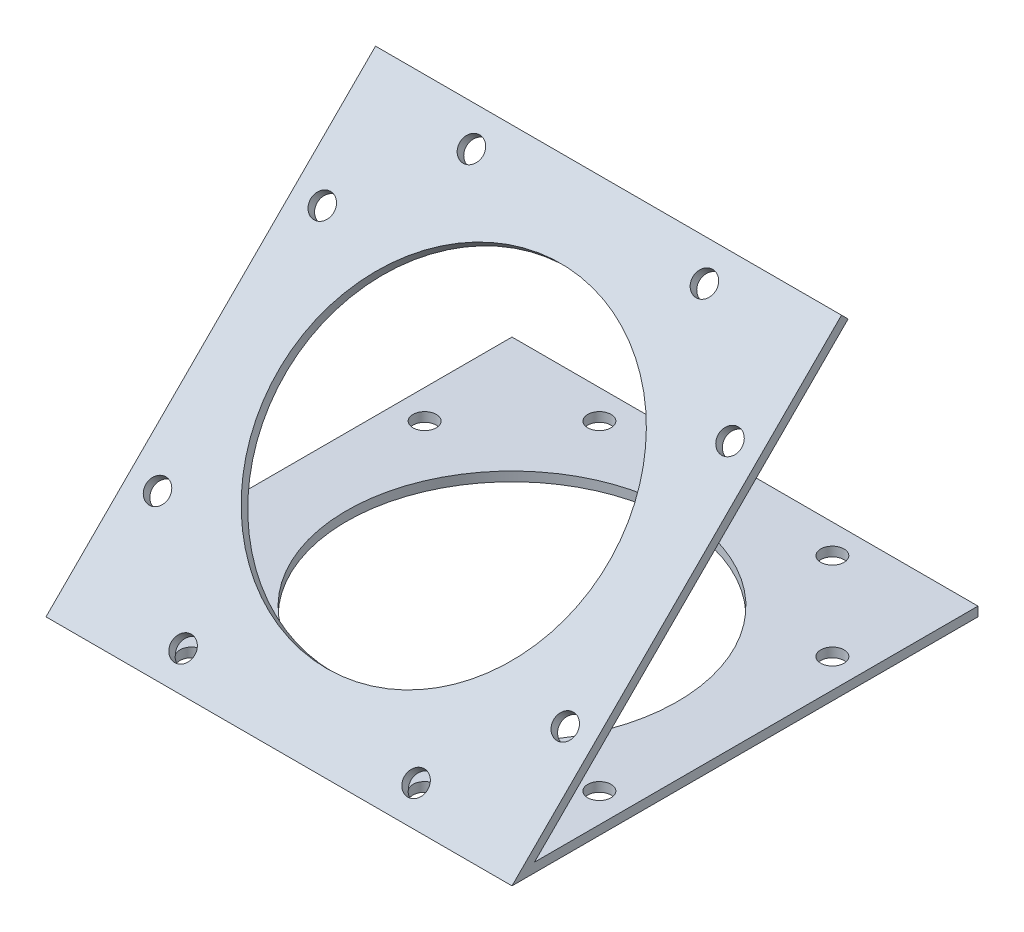
ISO-10303-21;
HEADER;
FILE_DESCRIPTION(('STEP AP214'),'2;1');
FILE_NAME('part.step','',(''),(''),'','','');
FILE_SCHEMA(('AUTOMOTIVE_DESIGN { 1 0 10303 214 1 1 1 1 }'));
ENDSEC;
DATA;
#1=APPLICATION_CONTEXT('core data for automotive mechanical design processes');
#2=APPLICATION_PROTOCOL_DEFINITION('international standard','automotive_design',2000,#1);
#3=PRODUCT_CONTEXT('',#1,'mechanical');
#4=PRODUCT('Part','Part','',(#3));
#5=PRODUCT_RELATED_PRODUCT_CATEGORY('part','',(#4));
#6=PRODUCT_DEFINITION_FORMATION('','',#4);
#7=PRODUCT_DEFINITION_CONTEXT('part definition',#1,'design');
#8=PRODUCT_DEFINITION('design','',#6,#7);
#9=PRODUCT_DEFINITION_SHAPE('','',#8);
#10=(LENGTH_UNIT() NAMED_UNIT(*) SI_UNIT(.MILLI.,.METRE.));
#11=(NAMED_UNIT(*) PLANE_ANGLE_UNIT() SI_UNIT($,.RADIAN.));
#12=(NAMED_UNIT(*) SI_UNIT($,.STERADIAN.) SOLID_ANGLE_UNIT());
#13=UNCERTAINTY_MEASURE_WITH_UNIT(LENGTH_MEASURE(1.E-05),#10,'distance_accuracy_value','');
#14=(GEOMETRIC_REPRESENTATION_CONTEXT(3) GLOBAL_UNCERTAINTY_ASSIGNED_CONTEXT((#13)) GLOBAL_UNIT_ASSIGNED_CONTEXT((#10,
#11,#12)) REPRESENTATION_CONTEXT('',''));
#15=CARTESIAN_POINT('',(0.,0.,0.));
#16=DIRECTION('',(0.,0.,1.));
#17=DIRECTION('',(1.,0.,0.));
#18=AXIS2_PLACEMENT_3D('',#15,#16,#17);
#19=CARTESIAN_POINT('',(200.,141.421356237309,-141.42135623731));
#20=DIRECTION('',(0.,-0.707106781186544,0.707106781186551));
#21=DIRECTION('',(0.,-0.707106781186551,-0.707106781186544));
#22=AXIS2_PLACEMENT_3D('',#19,#20,#21);
#23=PLANE('',#22);
#24=DIRECTION('',(0.,0.707106781186551,0.707106781186544));
#25=VECTOR('',#24,1.);
#26=CARTESIAN_POINT('',(0.,141.421356237309,-141.42135623731));
#27=LINE('',#26,#25);
#28=CARTESIAN_POINT('',(0.,138.592929112563,-144.249783362056));
#29=VERTEX_POINT('',#28);
#30=CARTESIAN_POINT('',(0.,141.421356237309,-141.42135623731));
#31=VERTEX_POINT('',#30);
#32=EDGE_CURVE('E151',#29,#31,#27,.T.);
#33=ORIENTED_EDGE('',*,*,#32,.T.);
#34=DIRECTION('',(-1.,0.,0.));
#35=VECTOR('',#34,1.);
#36=CARTESIAN_POINT('',(200.,141.421356237309,-141.42135623731));
#37=LINE('',#36,#35);
#38=CARTESIAN_POINT('',(200.,141.421356237309,-141.42135623731));
#39=VERTEX_POINT('',#38);
#40=EDGE_CURVE('E246',#39,#31,#37,.T.);
#41=ORIENTED_EDGE('',*,*,#40,.F.);
#42=DIRECTION('',(0.,0.707106781186551,0.707106781186544));
#43=VECTOR('',#42,1.);
#44=CARTESIAN_POINT('',(200.,141.421356237309,-141.42135623731));
#45=LINE('',#44,#43);
#46=CARTESIAN_POINT('',(200.,138.592929112563,-144.249783362056));
#47=VERTEX_POINT('',#46);
#48=EDGE_CURVE('E142',#47,#39,#45,.T.);
#49=ORIENTED_EDGE('',*,*,#48,.F.);
#50=DIRECTION('',(-1.,0.,0.));
#51=VECTOR('',#50,1.);
#52=CARTESIAN_POINT('',(200.,138.592929112563,-144.249783362056));
#53=LINE('',#52,#51);
#54=EDGE_CURVE('E128',#47,#29,#53,.T.);
#55=ORIENTED_EDGE('',*,*,#54,.T.);
#56=EDGE_LOOP('',(#33,#41,#49,#55));
#57=FACE_BOUND('',#56,.T.);
#58=ADVANCED_FACE('F34',(#57),#23,.F.);
#59=CARTESIAN_POINT('',(200.,141.421356237309,-141.42135623731));
#60=DIRECTION('',(0.,-0.707106781186551,-0.707106781186544));
#61=DIRECTION('',(0.,0.707106781186544,-0.707106781186551));
#62=AXIS2_PLACEMENT_3D('',#59,#60,#61);
#63=PLANE('',#62);
#64=CARTESIAN_POINT('',(100.,70.7106781186544,-70.7106781186551));
#65=DIRECTION('',(0.,0.707106781186551,0.707106781186544));
#66=DIRECTION('',(0.,-0.707106781186544,0.707106781186551));
#67=AXIS2_PLACEMENT_3D('',#64,#65,#66);
#68=CIRCLE('',#67,71.);
#69=CARTESIAN_POINT('',(100.,20.5060966544098,-20.50609665441));
#70=VERTEX_POINT('',#69);
#71=EDGE_CURVE('E215',#70,#70,#68,.T.);
#72=ORIENTED_EDGE('',*,*,#71,.F.);
#73=EDGE_LOOP('',(#72));
#74=FACE_BOUND('',#73,.T.);
#75=CARTESIAN_POINT('',(12.5,35.3553390593272,-35.3553390593276));
#76=DIRECTION('',(0.,0.707106781186551,0.707106781186544));
#77=DIRECTION('',(0.,-0.707106781186544,0.707106781186551));
#78=AXIS2_PLACEMENT_3D('',#75,#76,#77);
#79=CIRCLE('',#78,5.);
#80=CARTESIAN_POINT('',(12.5,31.8198051533945,-31.8198051533948));
#81=VERTEX_POINT('',#80);
#82=EDGE_CURVE('E167',#81,#81,#79,.T.);
#83=ORIENTED_EDGE('',*,*,#82,.F.);
#84=EDGE_LOOP('',(#83));
#85=FACE_BOUND('',#84,.T.);
#86=CARTESIAN_POINT('',(50.,132.582521472477,-132.582521472478));
#87=DIRECTION('',(0.,0.707106781186551,0.707106781186544));
#88=DIRECTION('',(0.,-0.707106781186544,0.707106781186551));
#89=AXIS2_PLACEMENT_3D('',#86,#87,#88);
#90=CIRCLE('',#89,5.);
#91=CARTESIAN_POINT('',(50.,129.046987566544,-129.046987566546));
#92=VERTEX_POINT('',#91);
#93=EDGE_CURVE('E175',#92,#92,#90,.T.);
#94=ORIENTED_EDGE('',*,*,#93,.F.);
#95=EDGE_LOOP('',(#94));
#96=FACE_BOUND('',#95,.T.);
#97=CARTESIAN_POINT('',(150.,132.582521472477,-132.582521472478));
#98=DIRECTION('',(0.,0.707106781186551,0.707106781186544));
#99=DIRECTION('',(0.,-0.707106781186544,0.707106781186551));
#100=AXIS2_PLACEMENT_3D('',#97,#98,#99);
#101=CIRCLE('',#100,4.99999999999999);
#102=CARTESIAN_POINT('',(150.,129.046987566544,-129.046987566546));
#103=VERTEX_POINT('',#102);
#104=EDGE_CURVE('E171',#103,#103,#101,.T.);
#105=ORIENTED_EDGE('',*,*,#104,.F.);
#106=EDGE_LOOP('',(#105));
#107=FACE_BOUND('',#106,.T.);
#108=CARTESIAN_POINT('',(187.5,35.3553390593272,-35.3553390593276));
#109=DIRECTION('',(0.,0.707106781186551,0.707106781186544));
#110=DIRECTION('',(0.,0.707106781186544,-0.707106781186551));
#111=AXIS2_PLACEMENT_3D('',#108,#109,#110);
#112=CIRCLE('',#111,5.00000000000002);
#113=CARTESIAN_POINT('',(187.5,38.8908729652599,-38.8908729652603));
#114=VERTEX_POINT('',#113);
#115=EDGE_CURVE('E168',#114,#114,#112,.T.);
#116=ORIENTED_EDGE('',*,*,#115,.F.);
#117=EDGE_LOOP('',(#116));
#118=FACE_BOUND('',#117,.T.);
#119=CARTESIAN_POINT('',(187.5,106.066017177982,-106.066017177983));
#120=DIRECTION('',(0.,0.707106781186551,0.707106781186544));
#121=DIRECTION('',(0.,0.707106781186544,-0.707106781186551));
#122=AXIS2_PLACEMENT_3D('',#119,#120,#121);
#123=CIRCLE('',#122,5.00000000000002);
#124=CARTESIAN_POINT('',(187.5,109.601551083914,-109.601551083915));
#125=VERTEX_POINT('',#124);
#126=EDGE_CURVE('E172',#125,#125,#123,.T.);
#127=ORIENTED_EDGE('',*,*,#126,.F.);
#128=EDGE_LOOP('',(#127));
#129=FACE_BOUND('',#128,.T.);
#130=CARTESIAN_POINT('',(150.,8.83883476483179,-8.83883476483188));
#131=DIRECTION('',(0.,0.707106781186551,0.707106781186544));
#132=DIRECTION('',(0.,0.707106781186544,-0.707106781186551));
#133=AXIS2_PLACEMENT_3D('',#130,#131,#132);
#134=CIRCLE('',#133,4.99999999999999);
#135=CARTESIAN_POINT('',(150.,12.3743686707645,-12.3743686707646));
#136=VERTEX_POINT('',#135);
#137=EDGE_CURVE('E183',#136,#136,#134,.T.);
#138=ORIENTED_EDGE('',*,*,#137,.F.);
#139=EDGE_LOOP('',(#138));
#140=FACE_BOUND('',#139,.T.);
#141=CARTESIAN_POINT('',(50.,8.83883476483181,-8.8388347648319));
#142=DIRECTION('',(0.,0.707106781186551,0.707106781186544));
#143=DIRECTION('',(0.,0.707106781186544,-0.707106781186551));
#144=AXIS2_PLACEMENT_3D('',#141,#142,#143);
#145=CIRCLE('',#144,5.);
#146=CARTESIAN_POINT('',(50.,12.3743686707645,-12.3743686707647));
#147=VERTEX_POINT('',#146);
#148=EDGE_CURVE('E180',#147,#147,#145,.T.);
#149=ORIENTED_EDGE('',*,*,#148,.F.);
#150=EDGE_LOOP('',(#149));
#151=FACE_BOUND('',#150,.T.);
#152=CARTESIAN_POINT('',(12.5,106.066017177982,-106.066017177983));
#153=DIRECTION('',(0.,0.707106781186551,0.707106781186544));
#154=DIRECTION('',(0.,-0.707106781186544,0.707106781186551));
#155=AXIS2_PLACEMENT_3D('',#152,#153,#154);
#156=CIRCLE('',#155,5.);
#157=CARTESIAN_POINT('',(12.5,102.530483272049,-102.53048327205));
#158=VERTEX_POINT('',#157);
#159=EDGE_CURVE('E163',#158,#158,#156,.T.);
#160=ORIENTED_EDGE('',*,*,#159,.F.);
#161=EDGE_LOOP('',(#160));
#162=FACE_BOUND('',#161,.T.);
#163=DIRECTION('',(0.,-0.707106781186544,0.707106781186551));
#164=VECTOR('',#163,1.);
#165=CARTESIAN_POINT('',(0.,141.421356237309,-141.42135623731));
#166=LINE('',#165,#164);
#167=CARTESIAN_POINT('',(0.,0.,0.));
#168=VERTEX_POINT('',#167);
#169=EDGE_CURVE('E149',#31,#168,#166,.T.);
#170=ORIENTED_EDGE('',*,*,#169,.T.);
#171=DIRECTION('',(-1.,0.,0.));
#172=VECTOR('',#171,1.);
#173=CARTESIAN_POINT('',(200.,0.,0.));
#174=LINE('',#173,#172);
#175=CARTESIAN_POINT('',(200.,0.,0.));
#176=VERTEX_POINT('',#175);
#177=EDGE_CURVE('E256',#176,#168,#174,.T.);
#178=ORIENTED_EDGE('',*,*,#177,.F.);
#179=DIRECTION('',(0.,-0.707106781186544,0.707106781186551));
#180=VECTOR('',#179,1.);
#181=CARTESIAN_POINT('',(200.,141.421356237309,-141.42135623731));
#182=LINE('',#181,#180);
#183=EDGE_CURVE('E159',#39,#176,#182,.T.);
#184=ORIENTED_EDGE('',*,*,#183,.F.);
#185=ORIENTED_EDGE('',*,*,#40,.T.);
#186=EDGE_LOOP('',(#170,#178,#184,#185));
#187=FACE_BOUND('',#186,.T.);
#188=ADVANCED_FACE('F238',(#74,#85,#96,#107,#118,#129,#140,#151,#162,#187),#63,.F.);
#189=CARTESIAN_POINT('',(200.,0.,0.));
#190=DIRECTION('',(0.,1.,0.));
#191=DIRECTION('',(0.,0.,1.));
#192=AXIS2_PLACEMENT_3D('',#189,#190,#191);
#193=PLANE('',#192);
#194=CARTESIAN_POINT('',(100.,0.,-100.));
#195=DIRECTION('',(0.,-1.,0.));
#196=DIRECTION('',(0.,0.,-1.));
#197=AXIS2_PLACEMENT_3D('',#194,#195,#196);
#198=CIRCLE('',#197,71.);
#199=CARTESIAN_POINT('',(100.,0.,-171.));
#200=VERTEX_POINT('',#199);
#201=EDGE_CURVE('E218',#200,#200,#198,.T.);
#202=ORIENTED_EDGE('',*,*,#201,.F.);
#203=EDGE_LOOP('',(#202));
#204=FACE_BOUND('',#203,.T.);
#205=CARTESIAN_POINT('',(12.5,0.,-150.));
#206=DIRECTION('',(0.,-1.,0.));
#207=DIRECTION('',(0.,0.,-1.));
#208=AXIS2_PLACEMENT_3D('',#205,#206,#207);
#209=CIRCLE('',#208,5.);
#210=CARTESIAN_POINT('',(12.5,0.,-155.));
#211=VERTEX_POINT('',#210);
#212=EDGE_CURVE('E193',#211,#211,#209,.T.);
#213=ORIENTED_EDGE('',*,*,#212,.F.);
#214=EDGE_LOOP('',(#213));
#215=FACE_BOUND('',#214,.T.);
#216=CARTESIAN_POINT('',(50.,0.,-187.5));
#217=DIRECTION('',(0.,-1.,0.));
#218=DIRECTION('',(0.,0.,-1.));
#219=AXIS2_PLACEMENT_3D('',#216,#217,#218);
#220=CIRCLE('',#219,5.00000000000001);
#221=CARTESIAN_POINT('',(50.,0.,-192.5));
#222=VERTEX_POINT('',#221);
#223=EDGE_CURVE('E201',#222,#222,#220,.T.);
#224=ORIENTED_EDGE('',*,*,#223,.F.);
#225=EDGE_LOOP('',(#224));
#226=FACE_BOUND('',#225,.T.);
#227=CARTESIAN_POINT('',(150.,0.,-187.5));
#228=DIRECTION('',(0.,-1.,0.));
#229=DIRECTION('',(0.,0.,-1.));
#230=AXIS2_PLACEMENT_3D('',#227,#228,#229);
#231=CIRCLE('',#230,4.99999999999999);
#232=CARTESIAN_POINT('',(150.,0.,-192.5));
#233=VERTEX_POINT('',#232);
#234=EDGE_CURVE('E197',#233,#233,#231,.T.);
#235=ORIENTED_EDGE('',*,*,#234,.F.);
#236=EDGE_LOOP('',(#235));
#237=FACE_BOUND('',#236,.T.);
#238=CARTESIAN_POINT('',(150.,0.,-12.5));
#239=DIRECTION('',(0.,-1.,0.));
#240=DIRECTION('',(0.,0.,1.));
#241=AXIS2_PLACEMENT_3D('',#238,#239,#240);
#242=CIRCLE('',#241,4.99999999999999);
#243=CARTESIAN_POINT('',(150.,0.,-7.50000000000002));
#244=VERTEX_POINT('',#243);
#245=EDGE_CURVE('E194',#244,#244,#242,.T.);
#246=ORIENTED_EDGE('',*,*,#245,.F.);
#247=EDGE_LOOP('',(#246));
#248=FACE_BOUND('',#247,.T.);
#249=CARTESIAN_POINT('',(187.5,0.,-50.));
#250=DIRECTION('',(0.,-1.,0.));
#251=DIRECTION('',(0.,0.,1.));
#252=AXIS2_PLACEMENT_3D('',#249,#250,#251);
#253=CIRCLE('',#252,5.00000000000002);
#254=CARTESIAN_POINT('',(187.5,0.,-45.));
#255=VERTEX_POINT('',#254);
#256=EDGE_CURVE('E209',#255,#255,#253,.T.);
#257=ORIENTED_EDGE('',*,*,#256,.F.);
#258=EDGE_LOOP('',(#257));
#259=FACE_BOUND('',#258,.T.);
#260=CARTESIAN_POINT('',(187.5,0.,-150.));
#261=DIRECTION('',(0.,-1.,0.));
#262=DIRECTION('',(0.,0.,1.));
#263=AXIS2_PLACEMENT_3D('',#260,#261,#262);
#264=CIRCLE('',#263,5.00000000000002);
#265=CARTESIAN_POINT('',(187.5,0.,-145.));
#266=VERTEX_POINT('',#265);
#267=EDGE_CURVE('E206',#266,#266,#264,.T.);
#268=ORIENTED_EDGE('',*,*,#267,.F.);
#269=EDGE_LOOP('',(#268));
#270=FACE_BOUND('',#269,.T.);
#271=CARTESIAN_POINT('',(50.,0.,-12.5));
#272=DIRECTION('',(0.,-1.,0.));
#273=DIRECTION('',(0.,0.,1.));
#274=AXIS2_PLACEMENT_3D('',#271,#272,#273);
#275=CIRCLE('',#274,5.00000000000001);
#276=CARTESIAN_POINT('',(50.,0.,-7.49999999999998));
#277=VERTEX_POINT('',#276);
#278=EDGE_CURVE('E198',#277,#277,#275,.T.);
#279=ORIENTED_EDGE('',*,*,#278,.F.);
#280=EDGE_LOOP('',(#279));
#281=FACE_BOUND('',#280,.T.);
#282=CARTESIAN_POINT('',(12.5,0.,-50.));
#283=DIRECTION('',(0.,-1.,0.));
#284=DIRECTION('',(0.,0.,-1.));
#285=AXIS2_PLACEMENT_3D('',#282,#283,#284);
#286=CIRCLE('',#285,5.);
#287=CARTESIAN_POINT('',(12.5,0.,-55.));
#288=VERTEX_POINT('',#287);
#289=EDGE_CURVE('E112',#288,#288,#286,.T.);
#290=ORIENTED_EDGE('',*,*,#289,.F.);
#291=EDGE_LOOP('',(#290));
#292=FACE_BOUND('',#291,.T.);
#293=DIRECTION('',(0.,0.,-1.));
#294=VECTOR('',#293,1.);
#295=CARTESIAN_POINT('',(0.,0.,0.));
#296=LINE('',#295,#294);
#297=CARTESIAN_POINT('',(0.,0.,-200.));
#298=VERTEX_POINT('',#297);
#299=EDGE_CURVE('E147',#168,#298,#296,.T.);
#300=ORIENTED_EDGE('',*,*,#299,.T.);
#301=DIRECTION('',(-1.,0.,0.));
#302=VECTOR('',#301,1.);
#303=CARTESIAN_POINT('',(200.,0.,-200.));
#304=LINE('',#303,#302);
#305=CARTESIAN_POINT('',(200.,0.,-200.));
#306=VERTEX_POINT('',#305);
#307=EDGE_CURVE('E125',#306,#298,#304,.T.);
#308=ORIENTED_EDGE('',*,*,#307,.F.);
#309=DIRECTION('',(0.,0.,-1.));
#310=VECTOR('',#309,1.);
#311=CARTESIAN_POINT('',(200.,0.,0.));
#312=LINE('',#311,#310);
#313=EDGE_CURVE('E157',#176,#306,#312,.T.);
#314=ORIENTED_EDGE('',*,*,#313,.F.);
#315=ORIENTED_EDGE('',*,*,#177,.T.);
#316=EDGE_LOOP('',(#300,#308,#314,#315));
#317=FACE_BOUND('',#316,.T.);
#318=ADVANCED_FACE('F242',(#204,#215,#226,#237,#248,#259,#270,#281,#292,#317),#193,.F.);
#319=CARTESIAN_POINT('',(200.,4.,-200.));
#320=DIRECTION('',(0.,0.,1.));
#321=DIRECTION('',(1.,0.,0.));
#322=AXIS2_PLACEMENT_3D('',#319,#320,#321);
#323=PLANE('',#322);
#324=DIRECTION('',(0.,1.,0.));
#325=VECTOR('',#324,1.);
#326=CARTESIAN_POINT('',(0.,4.,-200.));
#327=LINE('',#326,#325);
#328=CARTESIAN_POINT('',(0.,4.,-200.));
#329=VERTEX_POINT('',#328);
#330=EDGE_CURVE('E145',#298,#329,#327,.T.);
#331=ORIENTED_EDGE('',*,*,#330,.T.);
#332=DIRECTION('',(-1.,0.,0.));
#333=VECTOR('',#332,1.);
#334=CARTESIAN_POINT('',(200.,4.,-200.));
#335=LINE('',#334,#333);
#336=CARTESIAN_POINT('',(200.,4.,-200.));
#337=VERTEX_POINT('',#336);
#338=EDGE_CURVE('E121',#337,#329,#335,.T.);
#339=ORIENTED_EDGE('',*,*,#338,.F.);
#340=DIRECTION('',(0.,1.,0.));
#341=VECTOR('',#340,1.);
#342=CARTESIAN_POINT('',(200.,4.,-200.));
#343=LINE('',#342,#341);
#344=EDGE_CURVE('E155',#306,#337,#343,.T.);
#345=ORIENTED_EDGE('',*,*,#344,.F.);
#346=ORIENTED_EDGE('',*,*,#307,.T.);
#347=EDGE_LOOP('',(#331,#339,#345,#346));
#348=FACE_BOUND('',#347,.T.);
#349=ADVANCED_FACE('F334',(#348),#323,.F.);
#350=CARTESIAN_POINT('',(200.,4.,-9.65685424949253));
#351=DIRECTION('',(0.,-1.,0.));
#352=DIRECTION('',(0.,0.,-1.));
#353=AXIS2_PLACEMENT_3D('',#350,#351,#352);
#354=PLANE('',#353);
#355=CARTESIAN_POINT('',(100.,4.,-100.));
#356=DIRECTION('',(0.,-1.,0.));
#357=DIRECTION('',(0.,0.,-1.));
#358=AXIS2_PLACEMENT_3D('',#355,#356,#357);
#359=CIRCLE('',#358,71.);
#360=CARTESIAN_POINT('',(100.,4.,-171.));
#361=VERTEX_POINT('',#360);
#362=EDGE_CURVE('E37',#361,#361,#359,.T.);
#363=ORIENTED_EDGE('',*,*,#362,.T.);
#364=EDGE_LOOP('',(#363));
#365=FACE_BOUND('',#364,.T.);
#366=CARTESIAN_POINT('',(12.5,4.,-150.));
#367=DIRECTION('',(0.,-1.,0.));
#368=DIRECTION('',(0.,0.,-1.));
#369=AXIS2_PLACEMENT_3D('',#366,#367,#368);
#370=CIRCLE('',#369,5.);
#371=CARTESIAN_POINT('',(12.5,4.,-155.));
#372=VERTEX_POINT('',#371);
#373=EDGE_CURVE('E184',#372,#372,#370,.T.);
#374=ORIENTED_EDGE('',*,*,#373,.T.);
#375=EDGE_LOOP('',(#374));
#376=FACE_BOUND('',#375,.T.);
#377=CARTESIAN_POINT('',(50.,4.,-187.5));
#378=DIRECTION('',(0.,-1.,0.));
#379=DIRECTION('',(0.,0.,-1.));
#380=AXIS2_PLACEMENT_3D('',#377,#378,#379);
#381=CIRCLE('',#380,5.00000000000001);
#382=CARTESIAN_POINT('',(50.,4.,-192.5));
#383=VERTEX_POINT('',#382);
#384=EDGE_CURVE('E289',#383,#383,#381,.T.);
#385=ORIENTED_EDGE('',*,*,#384,.T.);
#386=EDGE_LOOP('',(#385));
#387=FACE_BOUND('',#386,.T.);
#388=CARTESIAN_POINT('',(150.,4.,-187.5));
#389=DIRECTION('',(0.,-1.,0.));
#390=DIRECTION('',(0.,0.,-1.));
#391=AXIS2_PLACEMENT_3D('',#388,#389,#390);
#392=CIRCLE('',#391,4.99999999999999);
#393=CARTESIAN_POINT('',(150.,4.,-192.5));
#394=VERTEX_POINT('',#393);
#395=EDGE_CURVE('E286',#394,#394,#392,.T.);
#396=ORIENTED_EDGE('',*,*,#395,.T.);
#397=EDGE_LOOP('',(#396));
#398=FACE_BOUND('',#397,.T.);
#399=CARTESIAN_POINT('',(187.5,4.,-50.));
#400=DIRECTION('',(0.,-1.,0.));
#401=DIRECTION('',(0.,0.,-1.));
#402=AXIS2_PLACEMENT_3D('',#399,#400,#401);
#403=CIRCLE('',#402,5.00000000000002);
#404=CARTESIAN_POINT('',(187.5,4.,-55.));
#405=VERTEX_POINT('',#404);
#406=EDGE_CURVE('E283',#405,#405,#403,.T.);
#407=ORIENTED_EDGE('',*,*,#406,.T.);
#408=EDGE_LOOP('',(#407));
#409=FACE_BOUND('',#408,.T.);
#410=CARTESIAN_POINT('',(187.5,4.,-150.));
#411=DIRECTION('',(0.,-1.,0.));
#412=DIRECTION('',(0.,0.,-1.));
#413=AXIS2_PLACEMENT_3D('',#410,#411,#412);
#414=CIRCLE('',#413,5.00000000000002);
#415=CARTESIAN_POINT('',(187.5,4.,-155.));
#416=VERTEX_POINT('',#415);
#417=EDGE_CURVE('E280',#416,#416,#414,.T.);
#418=ORIENTED_EDGE('',*,*,#417,.T.);
#419=EDGE_LOOP('',(#418));
#420=FACE_BOUND('',#419,.T.);
#421=CARTESIAN_POINT('',(12.5,4.,-50.));
#422=DIRECTION('',(0.,-1.,0.));
#423=DIRECTION('',(0.,0.,-1.));
#424=AXIS2_PLACEMENT_3D('',#421,#422,#423);
#425=CIRCLE('',#424,5.);
#426=CARTESIAN_POINT('',(12.5,4.,-55.));
#427=VERTEX_POINT('',#426);
#428=EDGE_CURVE('E189',#427,#427,#425,.T.);
#429=ORIENTED_EDGE('',*,*,#428,.T.);
#430=EDGE_LOOP('',(#429));
#431=FACE_BOUND('',#430,.T.);
#432=DIRECTION('',(-1.,0.,0.));
#433=VECTOR('',#432,1.);
#434=CARTESIAN_POINT('',(200.,4.,-9.65685424949253));
#435=LINE('',#434,#433);
#436=CARTESIAN_POINT('',(145.887029997511,4.,-9.65685424949253));
#437=VERTEX_POINT('',#436);
#438=CARTESIAN_POINT('',(54.1129700024888,4.00000000000014,-9.65685424949269));
#439=VERTEX_POINT('',#438);
#440=EDGE_CURVE('E111',#437,#439,#435,.T.);
#441=ORIENTED_EDGE('',*,*,#440,.F.);
#442=CARTESIAN_POINT('',(150.,4.,-12.5));
#443=DIRECTION('',(0.,-1.,0.));
#444=DIRECTION('',(0.,0.,-1.));
#445=AXIS2_PLACEMENT_3D('',#442,#443,#444);
#446=CIRCLE('',#445,4.99999999999999);
#447=CARTESIAN_POINT('',(154.112970002489,4.,-9.65685424949255));
#448=VERTEX_POINT('',#447);
#449=EDGE_CURVE('E55',#437,#448,#446,.T.);
#450=ORIENTED_EDGE('',*,*,#449,.T.);
#451=CARTESIAN_POINT('',(200.,4.,-9.65685424949253));
#452=VERTEX_POINT('',#451);
#453=EDGE_CURVE('E108',#452,#448,#435,.T.);
#454=ORIENTED_EDGE('',*,*,#453,.F.);
#455=DIRECTION('',(0.,0.,1.));
#456=VECTOR('',#455,1.);
#457=CARTESIAN_POINT('',(200.,4.,-9.65685424949253));
#458=LINE('',#457,#456);
#459=EDGE_CURVE('E137',#337,#452,#458,.T.);
#460=ORIENTED_EDGE('',*,*,#459,.F.);
#461=ORIENTED_EDGE('',*,*,#338,.T.);
#462=DIRECTION('',(0.,0.,1.));
#463=VECTOR('',#462,1.);
#464=CARTESIAN_POINT('',(0.,4.,-9.65685424949253));
#465=LINE('',#464,#463);
#466=CARTESIAN_POINT('',(0.,4.,-9.65685424949253));
#467=VERTEX_POINT('',#466);
#468=EDGE_CURVE('E143',#329,#467,#465,.T.);
#469=ORIENTED_EDGE('',*,*,#468,.T.);
#470=CARTESIAN_POINT('',(45.8870299975114,3.99999999999999,-9.65685424949254));
#471=VERTEX_POINT('',#470);
#472=EDGE_CURVE('E123',#471,#467,#435,.T.);
#473=ORIENTED_EDGE('',*,*,#472,.F.);
#474=CARTESIAN_POINT('',(50.,4.,-12.5));
#475=DIRECTION('',(0.,-1.,0.));
#476=DIRECTION('',(0.,0.,-1.));
#477=AXIS2_PLACEMENT_3D('',#474,#475,#476);
#478=CIRCLE('',#477,5.00000000000001);
#479=EDGE_CURVE('E49',#471,#439,#478,.T.);
#480=ORIENTED_EDGE('',*,*,#479,.T.);
#481=EDGE_LOOP('',(#441,#450,#454,#460,#461,#469,#473,#480));
#482=FACE_BOUND('',#481,.T.);
#483=ADVANCED_FACE('F105',(#365,#376,#387,#398,#409,#420,#431,#482),#354,.F.);
#484=CARTESIAN_POINT('',(200.,138.592929112563,-144.249783362056));
#485=DIRECTION('',(0.,0.707106781186551,0.707106781186544));
#486=DIRECTION('',(0.,-0.707106781186544,0.707106781186551));
#487=AXIS2_PLACEMENT_3D('',#484,#485,#486);
#488=PLANE('',#487);
#489=CARTESIAN_POINT('',(100.,67.8822509939082,-73.5391052434013));
#490=DIRECTION('',(0.,0.707106781186551,0.707106781186544));
#491=DIRECTION('',(0.,-0.707106781186544,0.707106781186551));
#492=AXIS2_PLACEMENT_3D('',#489,#490,#491);
#493=CIRCLE('',#492,71.);
#494=CARTESIAN_POINT('',(100.,17.6776695296635,-23.3345237791562));
#495=VERTEX_POINT('',#494);
#496=EDGE_CURVE('E214',#495,#495,#493,.T.);
#497=ORIENTED_EDGE('',*,*,#496,.T.);
#498=EDGE_LOOP('',(#497));
#499=FACE_BOUND('',#498,.T.);
#500=CARTESIAN_POINT('',(12.5,32.5269119345809,-38.1837661840738));
#501=DIRECTION('',(0.,0.707106781186551,0.707106781186544));
#502=DIRECTION('',(0.,-0.707106781186544,0.707106781186551));
#503=AXIS2_PLACEMENT_3D('',#500,#501,#502);
#504=CIRCLE('',#503,5.);
#505=CARTESIAN_POINT('',(12.5,28.9913780286482,-34.648232278141));
#506=VERTEX_POINT('',#505);
#507=EDGE_CURVE('E152',#506,#506,#504,.T.);
#508=ORIENTED_EDGE('',*,*,#507,.T.);
#509=EDGE_LOOP('',(#508));
#510=FACE_BOUND('',#509,.T.);
#511=CARTESIAN_POINT('',(50.,129.754094347731,-135.410948597225));
#512=DIRECTION('',(0.,0.707106781186551,0.707106781186544));
#513=DIRECTION('',(0.,-0.707106781186544,0.707106781186551));
#514=AXIS2_PLACEMENT_3D('',#511,#512,#513);
#515=CIRCLE('',#514,5.);
#516=CARTESIAN_POINT('',(50.,126.218560441798,-131.875414691292));
#517=VERTEX_POINT('',#516);
#518=EDGE_CURVE('E273',#517,#517,#515,.T.);
#519=ORIENTED_EDGE('',*,*,#518,.T.);
#520=EDGE_LOOP('',(#519));
#521=FACE_BOUND('',#520,.T.);
#522=CARTESIAN_POINT('',(150.,129.754094347731,-135.410948597225));
#523=DIRECTION('',(0.,0.707106781186551,0.707106781186544));
#524=DIRECTION('',(0.,-0.707106781186544,0.707106781186551));
#525=AXIS2_PLACEMENT_3D('',#522,#523,#524);
#526=CIRCLE('',#525,4.99999999999999);
#527=CARTESIAN_POINT('',(150.,126.218560441798,-131.875414691292));
#528=VERTEX_POINT('',#527);
#529=EDGE_CURVE('E270',#528,#528,#526,.T.);
#530=ORIENTED_EDGE('',*,*,#529,.T.);
#531=EDGE_LOOP('',(#530));
#532=FACE_BOUND('',#531,.T.);
#533=CARTESIAN_POINT('',(187.5,32.5269119345809,-38.1837661840738));
#534=DIRECTION('',(0.,0.707106781186551,0.707106781186544));
#535=DIRECTION('',(0.,-0.707106781186544,0.707106781186551));
#536=AXIS2_PLACEMENT_3D('',#533,#534,#535);
#537=CIRCLE('',#536,5.00000000000002);
#538=CARTESIAN_POINT('',(187.5,28.9913780286482,-34.648232278141));
#539=VERTEX_POINT('',#538);
#540=EDGE_CURVE('E267',#539,#539,#537,.T.);
#541=ORIENTED_EDGE('',*,*,#540,.T.);
#542=EDGE_LOOP('',(#541));
#543=FACE_BOUND('',#542,.T.);
#544=CARTESIAN_POINT('',(187.5,103.237590053235,-108.894444302729));
#545=DIRECTION('',(0.,0.707106781186551,0.707106781186544));
#546=DIRECTION('',(0.,-0.707106781186544,0.707106781186551));
#547=AXIS2_PLACEMENT_3D('',#544,#545,#546);
#548=CIRCLE('',#547,5.00000000000002);
#549=CARTESIAN_POINT('',(187.5,99.7020561473026,-105.358910396796));
#550=VERTEX_POINT('',#549);
#551=EDGE_CURVE('E263',#550,#550,#548,.T.);
#552=ORIENTED_EDGE('',*,*,#551,.T.);
#553=EDGE_LOOP('',(#552));
#554=FACE_BOUND('',#553,.T.);
#555=CARTESIAN_POINT('',(12.5,103.237590053235,-108.894444302729));
#556=DIRECTION('',(0.,0.707106781186551,0.707106781186544));
#557=DIRECTION('',(0.,-0.707106781186544,0.707106781186551));
#558=AXIS2_PLACEMENT_3D('',#555,#556,#557);
#559=CIRCLE('',#558,5.);
#560=CARTESIAN_POINT('',(12.5,99.7020561473026,-105.358910396796));
#561=VERTEX_POINT('',#560);
#562=EDGE_CURVE('E166',#561,#561,#559,.T.);
#563=ORIENTED_EDGE('',*,*,#562,.T.);
#564=EDGE_LOOP('',(#563));
#565=FACE_BOUND('',#564,.T.);
#566=ORIENTED_EDGE('',*,*,#453,.T.);
#567=CARTESIAN_POINT('',(150.,6.01040764008554,-11.6672618895781));
#568=DIRECTION('',(0.,0.707106781186551,0.707106781186544));
#569=DIRECTION('',(0.,-0.707106781186544,0.707106781186551));
#570=AXIS2_PLACEMENT_3D('',#567,#568,#569);
#571=CIRCLE('',#570,4.99999999999999);
#572=EDGE_CURVE('E100',#448,#437,#571,.T.);
#573=ORIENTED_EDGE('',*,*,#572,.T.);
#574=ORIENTED_EDGE('',*,*,#440,.T.);
#575=CARTESIAN_POINT('',(50.,6.01040764008555,-11.6672618895781));
#576=DIRECTION('',(0.,0.707106781186551,0.707106781186544));
#577=DIRECTION('',(0.,-0.707106781186544,0.707106781186551));
#578=AXIS2_PLACEMENT_3D('',#575,#576,#577);
#579=CIRCLE('',#578,5.);
#580=EDGE_CURVE('E116',#439,#471,#579,.T.);
#581=ORIENTED_EDGE('',*,*,#580,.T.);
#582=ORIENTED_EDGE('',*,*,#472,.T.);
#583=DIRECTION('',(0.,0.707106781186544,-0.707106781186551));
#584=VECTOR('',#583,1.);
#585=CARTESIAN_POINT('',(0.,138.592929112563,-144.249783362056));
#586=LINE('',#585,#584);
#587=EDGE_CURVE('E140',#467,#29,#586,.T.);
#588=ORIENTED_EDGE('',*,*,#587,.T.);
#589=ORIENTED_EDGE('',*,*,#54,.F.);
#590=DIRECTION('',(0.,0.707106781186544,-0.707106781186551));
#591=VECTOR('',#590,1.);
#592=CARTESIAN_POINT('',(200.,138.592929112563,-144.249783362056));
#593=LINE('',#592,#591);
#594=EDGE_CURVE('E120',#452,#47,#593,.T.);
#595=ORIENTED_EDGE('',*,*,#594,.F.);
#596=EDGE_LOOP('',(#566,#573,#574,#581,#582,#588,#589,#595));
#597=FACE_BOUND('',#596,.T.);
#598=ADVANCED_FACE('F118',(#499,#510,#521,#532,#543,#554,#565,#597),#488,.F.);
#599=CARTESIAN_POINT('',(200.,0.,0.));
#600=DIRECTION('',(-1.,0.,0.));
#601=DIRECTION('',(0.,0.,1.));
#602=AXIS2_PLACEMENT_3D('',#599,#600,#601);
#603=PLANE('',#602);
#604=ORIENTED_EDGE('',*,*,#48,.T.);
#605=ORIENTED_EDGE('',*,*,#183,.T.);
#606=ORIENTED_EDGE('',*,*,#313,.T.);
#607=ORIENTED_EDGE('',*,*,#344,.T.);
#608=ORIENTED_EDGE('',*,*,#459,.T.);
#609=ORIENTED_EDGE('',*,*,#594,.T.);
#610=EDGE_LOOP('',(#604,#605,#606,#607,#608,#609));
#611=FACE_BOUND('',#610,.T.);
#612=ADVANCED_FACE('F299',(#611),#603,.F.);
#613=CARTESIAN_POINT('',(0.,0.,0.));
#614=DIRECTION('',(-1.,0.,0.));
#615=DIRECTION('',(0.,0.,1.));
#616=AXIS2_PLACEMENT_3D('',#613,#614,#615);
#617=PLANE('',#616);
#618=ORIENTED_EDGE('',*,*,#32,.F.);
#619=ORIENTED_EDGE('',*,*,#587,.F.);
#620=ORIENTED_EDGE('',*,*,#468,.F.);
#621=ORIENTED_EDGE('',*,*,#330,.F.);
#622=ORIENTED_EDGE('',*,*,#299,.F.);
#623=ORIENTED_EDGE('',*,*,#169,.F.);
#624=EDGE_LOOP('',(#618,#619,#620,#621,#622,#623));
#625=FACE_BOUND('',#624,.T.);
#626=ADVANCED_FACE('F249',(#625),#617,.T.);
#627=CARTESIAN_POINT('',(12.5,102.530483272049,-109.601551083915));
#628=DIRECTION('',(0.,0.707106781186551,0.707106781186544));
#629=DIRECTION('',(0.,-0.707106781186544,0.707106781186551));
#630=AXIS2_PLACEMENT_3D('',#627,#628,#629);
#631=CYLINDRICAL_SURFACE('',#630,5.);
#632=ORIENTED_EDGE('',*,*,#159,.T.);
#633=EDGE_LOOP('',(#632));
#634=FACE_BOUND('',#633,.T.);
#635=ORIENTED_EDGE('',*,*,#562,.F.);
#636=EDGE_LOOP('',(#635));
#637=FACE_BOUND('',#636,.T.);
#638=ADVANCED_FACE('F313',(#634,#637),#631,.F.);
#639=CARTESIAN_POINT('',(50.,5.30330085889905,-12.3743686707646));
#640=DIRECTION('',(0.,0.707106781186551,0.707106781186544));
#641=DIRECTION('',(0.,-0.707106781186544,0.707106781186551));
#642=AXIS2_PLACEMENT_3D('',#639,#640,#641);
#643=CYLINDRICAL_SURFACE('',#642,5.);
#644=ORIENTED_EDGE('',*,*,#148,.T.);
#645=EDGE_LOOP('',(#644));
#646=FACE_BOUND('',#645,.T.);
#647=ORIENTED_EDGE('',*,*,#580,.F.);
#648=CARTESIAN_POINT('',(50.,5.17766952966368,-12.5));
#649=DIRECTION('',(0.,0.923879532511288,0.382683432365087));
#650=DIRECTION('',(0.,-0.382683432365087,0.923879532511288));
#651=AXIS2_PLACEMENT_3D('',#648,#649,#650);
#652=ELLIPSE('',#651,5.41196100146197,5.);
#653=EDGE_CURVE('E11',#439,#471,#652,.F.);
#654=ORIENTED_EDGE('',*,*,#653,.T.);
#655=EDGE_LOOP('',(#647,#654));
#656=FACE_BOUND('',#655,.T.);
#657=ADVANCED_FACE('F315',(#646,#656),#643,.F.);
#658=CARTESIAN_POINT('',(150.,5.30330085889903,-12.3743686707646));
#659=DIRECTION('',(0.,0.707106781186551,0.707106781186544));
#660=DIRECTION('',(0.,-0.707106781186544,0.707106781186551));
#661=AXIS2_PLACEMENT_3D('',#658,#659,#660);
#662=CYLINDRICAL_SURFACE('',#661,4.99999999999999);
#663=ORIENTED_EDGE('',*,*,#137,.T.);
#664=EDGE_LOOP('',(#663));
#665=FACE_BOUND('',#664,.T.);
#666=ORIENTED_EDGE('',*,*,#572,.F.);
#667=CARTESIAN_POINT('',(150.,5.17766952966361,-12.5));
#668=DIRECTION('',(0.,0.923879532511288,0.382683432365087));
#669=DIRECTION('',(0.,-0.382683432365087,0.923879532511288));
#670=AXIS2_PLACEMENT_3D('',#667,#668,#669);
#671=ELLIPSE('',#670,5.41196100146195,4.99999999999999);
#672=EDGE_CURVE('E42',#448,#437,#671,.F.);
#673=ORIENTED_EDGE('',*,*,#672,.T.);
#674=EDGE_LOOP('',(#666,#673));
#675=FACE_BOUND('',#674,.T.);
#676=ADVANCED_FACE('F114',(#665,#675),#662,.F.);
#677=CARTESIAN_POINT('',(187.5,102.530483272049,-109.601551083915));
#678=DIRECTION('',(0.,0.707106781186551,0.707106781186544));
#679=DIRECTION('',(0.,-0.707106781186544,0.707106781186551));
#680=AXIS2_PLACEMENT_3D('',#677,#678,#679);
#681=CYLINDRICAL_SURFACE('',#680,5.00000000000002);
#682=ORIENTED_EDGE('',*,*,#126,.T.);
#683=EDGE_LOOP('',(#682));
#684=FACE_BOUND('',#683,.T.);
#685=ORIENTED_EDGE('',*,*,#551,.F.);
#686=EDGE_LOOP('',(#685));
#687=FACE_BOUND('',#686,.T.);
#688=ADVANCED_FACE('F398',(#684,#687),#681,.F.);
#689=CARTESIAN_POINT('',(187.5,31.8198051533944,-38.8908729652603));
#690=DIRECTION('',(0.,0.707106781186551,0.707106781186544));
#691=DIRECTION('',(0.,-0.707106781186544,0.707106781186551));
#692=AXIS2_PLACEMENT_3D('',#689,#690,#691);
#693=CYLINDRICAL_SURFACE('',#692,5.00000000000002);
#694=ORIENTED_EDGE('',*,*,#115,.T.);
#695=EDGE_LOOP('',(#694));
#696=FACE_BOUND('',#695,.T.);
#697=ORIENTED_EDGE('',*,*,#540,.F.);
#698=EDGE_LOOP('',(#697));
#699=FACE_BOUND('',#698,.T.);
#700=ADVANCED_FACE('F327',(#696,#699),#693,.F.);
#701=CARTESIAN_POINT('',(150.,129.046987566544,-136.118055378411));
#702=DIRECTION('',(0.,0.707106781186551,0.707106781186544));
#703=DIRECTION('',(0.,-0.707106781186544,0.707106781186551));
#704=AXIS2_PLACEMENT_3D('',#701,#702,#703);
#705=CYLINDRICAL_SURFACE('',#704,4.99999999999999);
#706=ORIENTED_EDGE('',*,*,#104,.T.);
#707=EDGE_LOOP('',(#706));
#708=FACE_BOUND('',#707,.T.);
#709=ORIENTED_EDGE('',*,*,#529,.F.);
#710=EDGE_LOOP('',(#709));
#711=FACE_BOUND('',#710,.T.);
#712=ADVANCED_FACE('F410',(#708,#711),#705,.F.);
#713=CARTESIAN_POINT('',(50.,129.046987566544,-136.118055378411));
#714=DIRECTION('',(0.,0.707106781186551,0.707106781186544));
#715=DIRECTION('',(0.,-0.707106781186544,0.707106781186551));
#716=AXIS2_PLACEMENT_3D('',#713,#714,#715);
#717=CYLINDRICAL_SURFACE('',#716,5.);
#718=ORIENTED_EDGE('',*,*,#93,.T.);
#719=EDGE_LOOP('',(#718));
#720=FACE_BOUND('',#719,.T.);
#721=ORIENTED_EDGE('',*,*,#518,.F.);
#722=EDGE_LOOP('',(#721));
#723=FACE_BOUND('',#722,.T.);
#724=ADVANCED_FACE('F407',(#720,#723),#717,.F.);
#725=CARTESIAN_POINT('',(12.5,31.8198051533944,-38.8908729652603));
#726=DIRECTION('',(0.,0.707106781186551,0.707106781186544));
#727=DIRECTION('',(0.,-0.707106781186544,0.707106781186551));
#728=AXIS2_PLACEMENT_3D('',#725,#726,#727);
#729=CYLINDRICAL_SURFACE('',#728,5.);
#730=ORIENTED_EDGE('',*,*,#82,.T.);
#731=EDGE_LOOP('',(#730));
#732=FACE_BOUND('',#731,.T.);
#733=ORIENTED_EDGE('',*,*,#507,.F.);
#734=EDGE_LOOP('',(#733));
#735=FACE_BOUND('',#734,.T.);
#736=ADVANCED_FACE('F378',(#732,#735),#729,.F.);
#737=CARTESIAN_POINT('',(150.,5.,-12.5));
#738=DIRECTION('',(0.,-1.,0.));
#739=DIRECTION('',(0.,0.,-1.));
#740=AXIS2_PLACEMENT_3D('',#737,#738,#739);
#741=CYLINDRICAL_SURFACE('',#740,4.99999999999999);
#742=ORIENTED_EDGE('',*,*,#245,.T.);
#743=EDGE_LOOP('',(#742));
#744=FACE_BOUND('',#743,.T.);
#745=ORIENTED_EDGE('',*,*,#672,.F.);
#746=ORIENTED_EDGE('',*,*,#449,.F.);
#747=EDGE_LOOP('',(#745,#746));
#748=FACE_BOUND('',#747,.T.);
#749=ADVANCED_FACE('F96',(#744,#748),#741,.F.);
#750=CARTESIAN_POINT('',(50.,5.,-12.5));
#751=DIRECTION('',(0.,-1.,0.));
#752=DIRECTION('',(0.,0.,-1.));
#753=AXIS2_PLACEMENT_3D('',#750,#751,#752);
#754=CYLINDRICAL_SURFACE('',#753,5.00000000000001);
#755=ORIENTED_EDGE('',*,*,#278,.T.);
#756=EDGE_LOOP('',(#755));
#757=FACE_BOUND('',#756,.T.);
#758=ORIENTED_EDGE('',*,*,#653,.F.);
#759=ORIENTED_EDGE('',*,*,#479,.F.);
#760=EDGE_LOOP('',(#758,#759));
#761=FACE_BOUND('',#760,.T.);
#762=ADVANCED_FACE('F366',(#757,#761),#754,.F.);
#763=CARTESIAN_POINT('',(12.5,5.,-50.));
#764=DIRECTION('',(0.,-1.,0.));
#765=DIRECTION('',(0.,0.,-1.));
#766=AXIS2_PLACEMENT_3D('',#763,#764,#765);
#767=CYLINDRICAL_SURFACE('',#766,5.);
#768=ORIENTED_EDGE('',*,*,#289,.T.);
#769=EDGE_LOOP('',(#768));
#770=FACE_BOUND('',#769,.T.);
#771=ORIENTED_EDGE('',*,*,#428,.F.);
#772=EDGE_LOOP('',(#771));
#773=FACE_BOUND('',#772,.T.);
#774=ADVANCED_FACE('F368',(#770,#773),#767,.F.);
#775=CARTESIAN_POINT('',(187.5,5.,-150.));
#776=DIRECTION('',(0.,-1.,0.));
#777=DIRECTION('',(0.,0.,-1.));
#778=AXIS2_PLACEMENT_3D('',#775,#776,#777);
#779=CYLINDRICAL_SURFACE('',#778,5.00000000000002);
#780=ORIENTED_EDGE('',*,*,#267,.T.);
#781=EDGE_LOOP('',(#780));
#782=FACE_BOUND('',#781,.T.);
#783=ORIENTED_EDGE('',*,*,#417,.F.);
#784=EDGE_LOOP('',(#783));
#785=FACE_BOUND('',#784,.T.);
#786=ADVANCED_FACE('F375',(#782,#785),#779,.F.);
#787=CARTESIAN_POINT('',(187.5,5.,-50.));
#788=DIRECTION('',(0.,-1.,0.));
#789=DIRECTION('',(0.,0.,-1.));
#790=AXIS2_PLACEMENT_3D('',#787,#788,#789);
#791=CYLINDRICAL_SURFACE('',#790,5.00000000000002);
#792=ORIENTED_EDGE('',*,*,#256,.T.);
#793=EDGE_LOOP('',(#792));
#794=FACE_BOUND('',#793,.T.);
#795=ORIENTED_EDGE('',*,*,#406,.F.);
#796=EDGE_LOOP('',(#795));
#797=FACE_BOUND('',#796,.T.);
#798=ADVANCED_FACE('F383',(#794,#797),#791,.F.);
#799=CARTESIAN_POINT('',(150.,5.,-187.5));
#800=DIRECTION('',(0.,-1.,0.));
#801=DIRECTION('',(0.,0.,-1.));
#802=AXIS2_PLACEMENT_3D('',#799,#800,#801);
#803=CYLINDRICAL_SURFACE('',#802,4.99999999999999);
#804=ORIENTED_EDGE('',*,*,#234,.T.);
#805=EDGE_LOOP('',(#804));
#806=FACE_BOUND('',#805,.T.);
#807=ORIENTED_EDGE('',*,*,#395,.F.);
#808=EDGE_LOOP('',(#807));
#809=FACE_BOUND('',#808,.T.);
#810=ADVANCED_FACE('F393',(#806,#809),#803,.F.);
#811=CARTESIAN_POINT('',(50.,5.,-187.5));
#812=DIRECTION('',(0.,-1.,0.));
#813=DIRECTION('',(0.,0.,-1.));
#814=AXIS2_PLACEMENT_3D('',#811,#812,#813);
#815=CYLINDRICAL_SURFACE('',#814,5.00000000000001);
#816=ORIENTED_EDGE('',*,*,#223,.T.);
#817=EDGE_LOOP('',(#816));
#818=FACE_BOUND('',#817,.T.);
#819=ORIENTED_EDGE('',*,*,#384,.F.);
#820=EDGE_LOOP('',(#819));
#821=FACE_BOUND('',#820,.T.);
#822=ADVANCED_FACE('F389',(#818,#821),#815,.F.);
#823=CARTESIAN_POINT('',(12.5,5.,-150.));
#824=DIRECTION('',(0.,-1.,0.));
#825=DIRECTION('',(0.,0.,-1.));
#826=AXIS2_PLACEMENT_3D('',#823,#824,#825);
#827=CYLINDRICAL_SURFACE('',#826,5.);
#828=ORIENTED_EDGE('',*,*,#212,.T.);
#829=EDGE_LOOP('',(#828));
#830=FACE_BOUND('',#829,.T.);
#831=ORIENTED_EDGE('',*,*,#373,.F.);
#832=EDGE_LOOP('',(#831));
#833=FACE_BOUND('',#832,.T.);
#834=ADVANCED_FACE('F234',(#830,#833),#827,.F.);
#835=CARTESIAN_POINT('',(100.,63.6396103067889,-77.7817459305206));
#836=DIRECTION('',(0.,0.707106781186551,0.707106781186544));
#837=DIRECTION('',(0.,-0.707106781186544,0.707106781186551));
#838=AXIS2_PLACEMENT_3D('',#835,#836,#837);
#839=CYLINDRICAL_SURFACE('',#838,71.);
#840=ORIENTED_EDGE('',*,*,#71,.T.);
#841=EDGE_LOOP('',(#840));
#842=FACE_BOUND('',#841,.T.);
#843=ORIENTED_EDGE('',*,*,#496,.F.);
#844=EDGE_LOOP('',(#843));
#845=FACE_BOUND('',#844,.T.);
#846=ADVANCED_FACE('F229',(#842,#845),#839,.F.);
#847=CARTESIAN_POINT('',(100.,10.,-100.));
#848=DIRECTION('',(0.,-1.,0.));
#849=DIRECTION('',(0.,0.,-1.));
#850=AXIS2_PLACEMENT_3D('',#847,#848,#849);
#851=CYLINDRICAL_SURFACE('',#850,71.);
#852=ORIENTED_EDGE('',*,*,#201,.T.);
#853=EDGE_LOOP('',(#852));
#854=FACE_BOUND('',#853,.T.);
#855=ORIENTED_EDGE('',*,*,#362,.F.);
#856=EDGE_LOOP('',(#855));
#857=FACE_BOUND('',#856,.T.);
#858=ADVANCED_FACE('F227',(#854,#857),#851,.F.);
#859=CLOSED_SHELL('',(#58,#188,#318,#349,#483,#598,#612,#626,#638,#657,#676,#688,#700,#712,#724,
#736,#749,#762,#774,#786,#798,#810,#822,#834,#846,#858));
#860=MANIFOLD_SOLID_BREP('B2',#859);
#861=ADVANCED_BREP_SHAPE_REPRESENTATION('',(#18,#860),#14);
#862=SHAPE_DEFINITION_REPRESENTATION(#9,#861);
ENDSEC;
END-ISO-10303-21;
